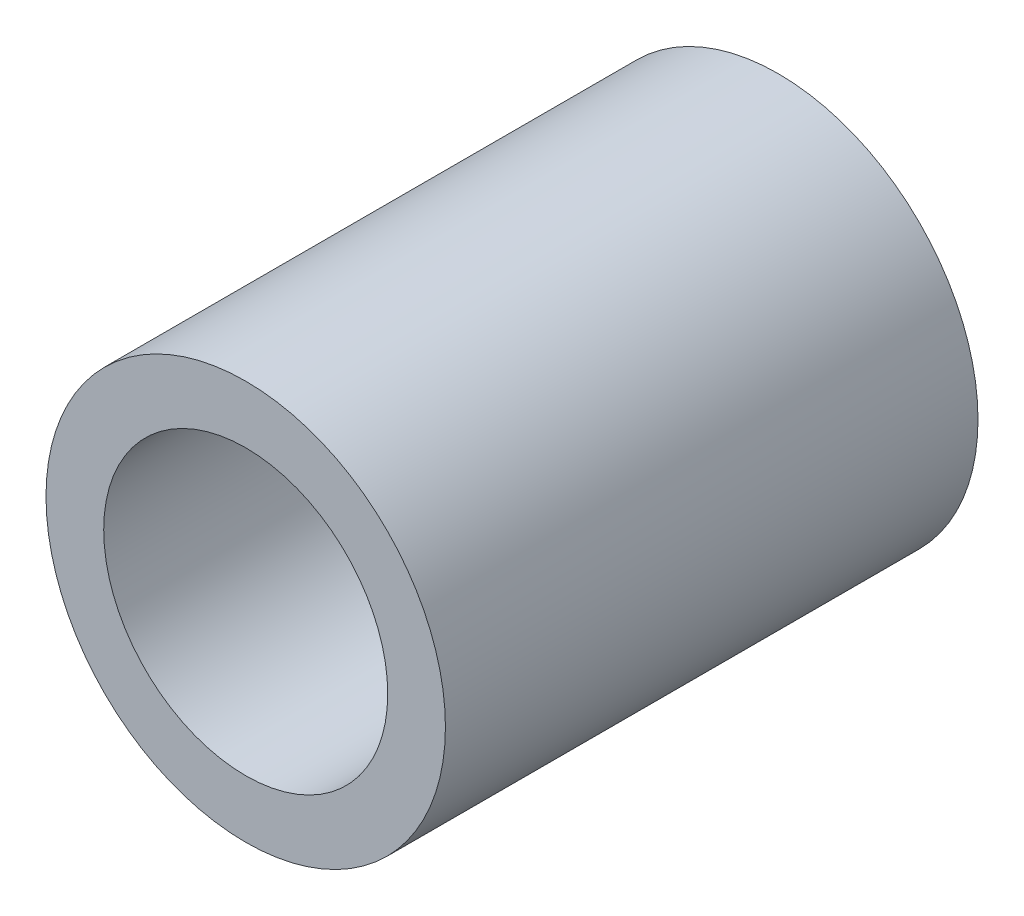
ISO-10303-21;
HEADER;
FILE_DESCRIPTION(('STEP AP214'),'2;1');
FILE_NAME('part.step','',(''),(''),'','','');
FILE_SCHEMA(('AUTOMOTIVE_DESIGN { 1 0 10303 214 1 1 1 1 }'));
ENDSEC;
DATA;
#1=APPLICATION_CONTEXT('core data for automotive mechanical design processes');
#2=APPLICATION_PROTOCOL_DEFINITION('international standard','automotive_design',2000,#1);
#3=PRODUCT_CONTEXT('',#1,'mechanical');
#4=PRODUCT('Part','Part','',(#3));
#5=PRODUCT_RELATED_PRODUCT_CATEGORY('part','',(#4));
#6=PRODUCT_DEFINITION_FORMATION('','',#4);
#7=PRODUCT_DEFINITION_CONTEXT('part definition',#1,'design');
#8=PRODUCT_DEFINITION('design','',#6,#7);
#9=PRODUCT_DEFINITION_SHAPE('','',#8);
#10=(LENGTH_UNIT() NAMED_UNIT(*) SI_UNIT(.MILLI.,.METRE.));
#11=(NAMED_UNIT(*) PLANE_ANGLE_UNIT() SI_UNIT($,.RADIAN.));
#12=(NAMED_UNIT(*) SI_UNIT($,.STERADIAN.) SOLID_ANGLE_UNIT());
#13=UNCERTAINTY_MEASURE_WITH_UNIT(LENGTH_MEASURE(1.E-05),#10,'distance_accuracy_value','');
#14=(GEOMETRIC_REPRESENTATION_CONTEXT(3) GLOBAL_UNCERTAINTY_ASSIGNED_CONTEXT((#13)) GLOBAL_UNIT_ASSIGNED_CONTEXT((#10,
#11,#12)) REPRESENTATION_CONTEXT('',''));
#15=CARTESIAN_POINT('',(0.,0.,0.));
#16=DIRECTION('',(0.,0.,1.));
#17=DIRECTION('',(1.,0.,0.));
#18=AXIS2_PLACEMENT_3D('',#15,#16,#17);
#19=CARTESIAN_POINT('',(0.,0.,3.));
#20=DIRECTION('',(0.,0.,1.));
#21=DIRECTION('',(1.,0.,0.));
#22=AXIS2_PLACEMENT_3D('',#19,#20,#21);
#23=PLANE('',#22);
#24=CARTESIAN_POINT('',(0.,0.,3.));
#25=DIRECTION('',(0.,0.,1.));
#26=DIRECTION('',(1.,0.,0.));
#27=AXIS2_PLACEMENT_3D('',#24,#25,#26);
#28=CIRCLE('',#27,2.25);
#29=CARTESIAN_POINT('',(2.25,0.,3.));
#30=VERTEX_POINT('',#29);
#31=EDGE_CURVE('E10',#30,#30,#28,.T.);
#32=ORIENTED_EDGE('',*,*,#31,.T.);
#33=EDGE_LOOP('',(#32));
#34=FACE_BOUND('',#33,.T.);
#35=CARTESIAN_POINT('',(0.,0.,3.));
#36=DIRECTION('',(0.,0.,1.));
#37=DIRECTION('',(1.,0.,0.));
#38=AXIS2_PLACEMENT_3D('',#35,#36,#37);
#39=CIRCLE('',#38,1.6);
#40=CARTESIAN_POINT('',(1.6,0.,3.));
#41=VERTEX_POINT('',#40);
#42=EDGE_CURVE('E49',#41,#41,#39,.T.);
#43=ORIENTED_EDGE('',*,*,#42,.F.);
#44=EDGE_LOOP('',(#43));
#45=FACE_BOUND('',#44,.T.);
#46=ADVANCED_FACE('F35',(#34,#45),#23,.T.);
#47=CARTESIAN_POINT('',(0.,0.,-3.));
#48=DIRECTION('',(0.,0.,1.));
#49=DIRECTION('',(1.,0.,0.));
#50=AXIS2_PLACEMENT_3D('',#47,#48,#49);
#51=PLANE('',#50);
#52=CARTESIAN_POINT('',(0.,0.,-3.));
#53=DIRECTION('',(0.,0.,1.));
#54=DIRECTION('',(1.,0.,0.));
#55=AXIS2_PLACEMENT_3D('',#52,#53,#54);
#56=CIRCLE('',#55,2.25);
#57=CARTESIAN_POINT('',(2.25,0.,-3.));
#58=VERTEX_POINT('',#57);
#59=EDGE_CURVE('E39',#58,#58,#56,.T.);
#60=ORIENTED_EDGE('',*,*,#59,.F.);
#61=EDGE_LOOP('',(#60));
#62=FACE_BOUND('',#61,.T.);
#63=CARTESIAN_POINT('',(0.,0.,-3.));
#64=DIRECTION('',(0.,0.,1.));
#65=DIRECTION('',(1.,0.,0.));
#66=AXIS2_PLACEMENT_3D('',#63,#64,#65);
#67=CIRCLE('',#66,1.6);
#68=CARTESIAN_POINT('',(1.6,0.,-3.));
#69=VERTEX_POINT('',#68);
#70=EDGE_CURVE('E51',#69,#69,#67,.T.);
#71=ORIENTED_EDGE('',*,*,#70,.T.);
#72=EDGE_LOOP('',(#71));
#73=FACE_BOUND('',#72,.T.);
#74=ADVANCED_FACE('F62',(#62,#73),#51,.F.);
#75=CARTESIAN_POINT('',(0.,0.,3.));
#76=DIRECTION('',(0.,0.,-1.));
#77=DIRECTION('',(-1.,0.,0.));
#78=AXIS2_PLACEMENT_3D('',#75,#76,#77);
#79=CYLINDRICAL_SURFACE('',#78,2.25);
#80=ORIENTED_EDGE('',*,*,#31,.F.);
#81=EDGE_LOOP('',(#80));
#82=FACE_BOUND('',#81,.T.);
#83=ORIENTED_EDGE('',*,*,#59,.T.);
#84=EDGE_LOOP('',(#83));
#85=FACE_BOUND('',#84,.T.);
#86=ADVANCED_FACE('F37',(#82,#85),#79,.T.);
#87=CARTESIAN_POINT('',(0.,0.,3.));
#88=DIRECTION('',(0.,0.,-1.));
#89=DIRECTION('',(-1.,0.,0.));
#90=AXIS2_PLACEMENT_3D('',#87,#88,#89);
#91=CYLINDRICAL_SURFACE('',#90,1.6);
#92=ORIENTED_EDGE('',*,*,#42,.T.);
#93=EDGE_LOOP('',(#92));
#94=FACE_BOUND('',#93,.T.);
#95=ORIENTED_EDGE('',*,*,#70,.F.);
#96=EDGE_LOOP('',(#95));
#97=FACE_BOUND('',#96,.T.);
#98=ADVANCED_FACE('F58',(#94,#97),#91,.F.);
#99=CLOSED_SHELL('',(#46,#74,#86,#98));
#100=MANIFOLD_SOLID_BREP('B2',#99);
#101=ADVANCED_BREP_SHAPE_REPRESENTATION('',(#18,#100),#14);
#102=SHAPE_DEFINITION_REPRESENTATION(#9,#101);
ENDSEC;
END-ISO-10303-21;
